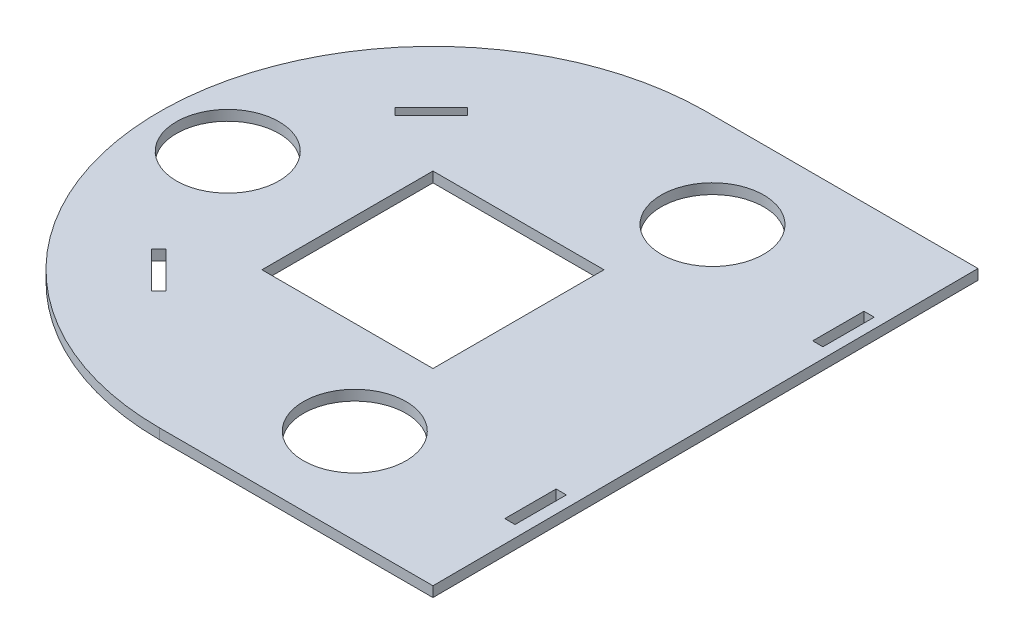
ISO-10303-21;
HEADER;
FILE_DESCRIPTION(('STEP AP214'),'2;1');
FILE_NAME('part.step','',(''),(''),'','','');
FILE_SCHEMA(('AUTOMOTIVE_DESIGN { 1 0 10303 214 1 1 1 1 }'));
ENDSEC;
DATA;
#1=APPLICATION_CONTEXT('core data for automotive mechanical design processes');
#2=APPLICATION_PROTOCOL_DEFINITION('international standard','automotive_design',2000,#1);
#3=PRODUCT_CONTEXT('',#1,'mechanical');
#4=PRODUCT('Part','Part','',(#3));
#5=PRODUCT_RELATED_PRODUCT_CATEGORY('part','',(#4));
#6=PRODUCT_DEFINITION_FORMATION('','',#4);
#7=PRODUCT_DEFINITION_CONTEXT('part definition',#1,'design');
#8=PRODUCT_DEFINITION('design','',#6,#7);
#9=PRODUCT_DEFINITION_SHAPE('','',#8);
#10=(LENGTH_UNIT() NAMED_UNIT(*) SI_UNIT(.MILLI.,.METRE.));
#11=(NAMED_UNIT(*) PLANE_ANGLE_UNIT() SI_UNIT($,.RADIAN.));
#12=(NAMED_UNIT(*) SI_UNIT($,.STERADIAN.) SOLID_ANGLE_UNIT());
#13=UNCERTAINTY_MEASURE_WITH_UNIT(LENGTH_MEASURE(1.E-05),#10,'distance_accuracy_value','');
#14=(GEOMETRIC_REPRESENTATION_CONTEXT(3) GLOBAL_UNCERTAINTY_ASSIGNED_CONTEXT((#13)) GLOBAL_UNIT_ASSIGNED_CONTEXT((#10,
#11,#12)) REPRESENTATION_CONTEXT('',''));
#15=CARTESIAN_POINT('',(0.,0.,0.));
#16=DIRECTION('',(0.,0.,1.));
#17=DIRECTION('',(1.,0.,0.));
#18=AXIS2_PLACEMENT_3D('',#15,#16,#17);
#19=CARTESIAN_POINT('',(0.,3.,54.9972823705687));
#20=DIRECTION('',(0.,0.,-1.));
#21=DIRECTION('',(-1.,0.,0.));
#22=AXIS2_PLACEMENT_3D('',#19,#20,#21);
#23=PLANE('',#22);
#24=DIRECTION('',(1.,0.,0.));
#25=VECTOR('',#24,1.);
#26=CARTESIAN_POINT('',(0.,0.,54.9972823705687));
#27=LINE('',#26,#25);
#28=CARTESIAN_POINT('',(-24.3405962363661,0.,54.9972823705687));
#29=VERTEX_POINT('',#28);
#30=CARTESIAN_POINT('',(25.6594037636339,0.,54.9972823705687));
#31=VERTEX_POINT('',#30);
#32=EDGE_CURVE('E259',#29,#31,#27,.T.);
#33=ORIENTED_EDGE('',*,*,#32,.T.);
#34=DIRECTION('',(0.,-1.,0.));
#35=VECTOR('',#34,1.);
#36=CARTESIAN_POINT('',(25.6594037636339,3.,54.9972823705687));
#37=LINE('',#36,#35);
#38=CARTESIAN_POINT('',(25.6594037636339,3.,54.9972823705687));
#39=VERTEX_POINT('',#38);
#40=EDGE_CURVE('E11',#39,#31,#37,.T.);
#41=ORIENTED_EDGE('',*,*,#40,.F.);
#42=DIRECTION('',(1.,0.,0.));
#43=VECTOR('',#42,1.);
#44=CARTESIAN_POINT('',(0.,3.,54.9972823705687));
#45=LINE('',#44,#43);
#46=CARTESIAN_POINT('',(-24.3405962363661,3.,54.9972823705687));
#47=VERTEX_POINT('',#46);
#48=EDGE_CURVE('E181',#47,#39,#45,.T.);
#49=ORIENTED_EDGE('',*,*,#48,.F.);
#50=DIRECTION('',(0.,-1.,0.));
#51=VECTOR('',#50,1.);
#52=CARTESIAN_POINT('',(-24.3405962363661,3.,54.9972823705687));
#53=LINE('',#52,#51);
#54=EDGE_CURVE('E54',#47,#29,#53,.T.);
#55=ORIENTED_EDGE('',*,*,#54,.T.);
#56=EDGE_LOOP('',(#33,#41,#49,#55));
#57=FACE_BOUND('',#56,.T.);
#58=ADVANCED_FACE('F35',(#57),#23,.F.);
#59=CARTESIAN_POINT('',(25.6594037636339,3.,0.));
#60=DIRECTION('',(1.,0.,0.));
#61=DIRECTION('',(0.,0.,-1.));
#62=AXIS2_PLACEMENT_3D('',#59,#60,#61);
#63=PLANE('',#62);
#64=DIRECTION('',(0.,0.,1.));
#65=VECTOR('',#64,1.);
#66=CARTESIAN_POINT('',(25.6594037636339,0.,0.));
#67=LINE('',#66,#65);
#68=CARTESIAN_POINT('',(25.6594037636339,0.,104.997282370569));
#69=VERTEX_POINT('',#68);
#70=EDGE_CURVE('E187',#31,#69,#67,.T.);
#71=ORIENTED_EDGE('',*,*,#70,.T.);
#72=DIRECTION('',(0.,-1.,0.));
#73=VECTOR('',#72,1.);
#74=CARTESIAN_POINT('',(25.6594037636339,3.,104.997282370569));
#75=LINE('',#74,#73);
#76=CARTESIAN_POINT('',(25.6594037636339,3.,104.997282370569));
#77=VERTEX_POINT('',#76);
#78=EDGE_CURVE('E45',#77,#69,#75,.T.);
#79=ORIENTED_EDGE('',*,*,#78,.F.);
#80=DIRECTION('',(0.,0.,1.));
#81=VECTOR('',#80,1.);
#82=CARTESIAN_POINT('',(25.6594037636339,3.,0.));
#83=LINE('',#82,#81);
#84=EDGE_CURVE('E175',#39,#77,#83,.T.);
#85=ORIENTED_EDGE('',*,*,#84,.F.);
#86=ORIENTED_EDGE('',*,*,#40,.T.);
#87=EDGE_LOOP('',(#71,#79,#85,#86));
#88=FACE_BOUND('',#87,.T.);
#89=ADVANCED_FACE('F186',(#88),#63,.F.);
#90=CARTESIAN_POINT('',(0.,3.,104.997282370569));
#91=DIRECTION('',(0.,0.,-1.));
#92=DIRECTION('',(-1.,0.,0.));
#93=AXIS2_PLACEMENT_3D('',#90,#91,#92);
#94=PLANE('',#93);
#95=DIRECTION('',(1.,0.,0.));
#96=VECTOR('',#95,1.);
#97=CARTESIAN_POINT('',(0.,0.,104.997282370569));
#98=LINE('',#97,#96);
#99=CARTESIAN_POINT('',(-24.3405962363661,0.,104.997282370569));
#100=VERTEX_POINT('',#99);
#101=EDGE_CURVE('E262',#100,#69,#98,.T.);
#102=ORIENTED_EDGE('',*,*,#101,.F.);
#103=DIRECTION('',(0.,-1.,0.));
#104=VECTOR('',#103,1.);
#105=CARTESIAN_POINT('',(-24.3405962363661,3.,104.997282370569));
#106=LINE('',#105,#104);
#107=CARTESIAN_POINT('',(-24.3405962363661,3.,104.997282370569));
#108=VERTEX_POINT('',#107);
#109=EDGE_CURVE('E114',#108,#100,#106,.T.);
#110=ORIENTED_EDGE('',*,*,#109,.F.);
#111=DIRECTION('',(1.,0.,0.));
#112=VECTOR('',#111,1.);
#113=CARTESIAN_POINT('',(0.,3.,104.997282370569));
#114=LINE('',#113,#112);
#115=EDGE_CURVE('E180',#108,#77,#114,.T.);
#116=ORIENTED_EDGE('',*,*,#115,.T.);
#117=ORIENTED_EDGE('',*,*,#78,.T.);
#118=EDGE_LOOP('',(#102,#110,#116,#117));
#119=FACE_BOUND('',#118,.T.);
#120=ADVANCED_FACE('F191',(#119),#94,.T.);
#121=CARTESIAN_POINT('',(77.1594037636339,3.,0.));
#122=DIRECTION('',(-1.,0.,0.));
#123=DIRECTION('',(0.,0.,1.));
#124=AXIS2_PLACEMENT_3D('',#121,#122,#123);
#125=PLANE('',#124);
#126=DIRECTION('',(0.,0.,-1.));
#127=VECTOR('',#126,1.);
#128=CARTESIAN_POINT('',(77.1594037636339,0.,0.));
#129=LINE('',#128,#127);
#130=CARTESIAN_POINT('',(77.1594037636339,0.,42.4972823705687));
#131=VERTEX_POINT('',#130);
#132=CARTESIAN_POINT('',(77.1594037636339,0.,27.4972823705687));
#133=VERTEX_POINT('',#132);
#134=EDGE_CURVE('E244',#131,#133,#129,.T.);
#135=ORIENTED_EDGE('',*,*,#134,.F.);
#136=DIRECTION('',(0.,-1.,0.));
#137=VECTOR('',#136,1.);
#138=CARTESIAN_POINT('',(77.1594037636339,3.,42.4972823705687));
#139=LINE('',#138,#137);
#140=CARTESIAN_POINT('',(77.1594037636339,3.,42.4972823705687));
#141=VERTEX_POINT('',#140);
#142=EDGE_CURVE('E269',#141,#131,#139,.T.);
#143=ORIENTED_EDGE('',*,*,#142,.F.);
#144=DIRECTION('',(0.,0.,-1.));
#145=VECTOR('',#144,1.);
#146=CARTESIAN_POINT('',(77.1594037636339,3.,0.));
#147=LINE('',#146,#145);
#148=CARTESIAN_POINT('',(77.1594037636339,3.,27.4972823705687));
#149=VERTEX_POINT('',#148);
#150=EDGE_CURVE('E390',#141,#149,#147,.T.);
#151=ORIENTED_EDGE('',*,*,#150,.T.);
#152=DIRECTION('',(0.,-1.,0.));
#153=VECTOR('',#152,1.);
#154=CARTESIAN_POINT('',(77.1594037636339,3.,27.4972823705687));
#155=LINE('',#154,#153);
#156=EDGE_CURVE('E271',#149,#133,#155,.T.);
#157=ORIENTED_EDGE('',*,*,#156,.T.);
#158=EDGE_LOOP('',(#135,#143,#151,#157));
#159=FACE_BOUND('',#158,.T.);
#160=ADVANCED_FACE('F446',(#159),#125,.T.);
#161=CARTESIAN_POINT('',(0.,3.,42.4972823705687));
#162=DIRECTION('',(0.,0.,1.));
#163=DIRECTION('',(1.,0.,0.));
#164=AXIS2_PLACEMENT_3D('',#161,#162,#163);
#165=PLANE('',#164);
#166=DIRECTION('',(-1.,0.,0.));
#167=VECTOR('',#166,1.);
#168=CARTESIAN_POINT('',(0.,0.,42.4972823705687));
#169=LINE('',#168,#167);
#170=CARTESIAN_POINT('',(74.1594037636339,0.,42.4972823705687));
#171=VERTEX_POINT('',#170);
#172=EDGE_CURVE('E247',#131,#171,#169,.T.);
#173=ORIENTED_EDGE('',*,*,#172,.T.);
#174=DIRECTION('',(0.,-1.,0.));
#175=VECTOR('',#174,1.);
#176=CARTESIAN_POINT('',(74.1594037636339,3.,42.4972823705687));
#177=LINE('',#176,#175);
#178=CARTESIAN_POINT('',(74.1594037636339,3.,42.4972823705687));
#179=VERTEX_POINT('',#178);
#180=EDGE_CURVE('E276',#179,#171,#177,.T.);
#181=ORIENTED_EDGE('',*,*,#180,.F.);
#182=DIRECTION('',(-1.,0.,0.));
#183=VECTOR('',#182,1.);
#184=CARTESIAN_POINT('',(0.,3.,42.4972823705687));
#185=LINE('',#184,#183);
#186=EDGE_CURVE('E393',#141,#179,#185,.T.);
#187=ORIENTED_EDGE('',*,*,#186,.F.);
#188=ORIENTED_EDGE('',*,*,#142,.T.);
#189=EDGE_LOOP('',(#173,#181,#187,#188));
#190=FACE_BOUND('',#189,.T.);
#191=ADVANCED_FACE('F442',(#190),#165,.F.);
#192=CARTESIAN_POINT('',(74.1594037636339,3.,0.));
#193=DIRECTION('',(-1.,0.,0.));
#194=DIRECTION('',(0.,0.,1.));
#195=AXIS2_PLACEMENT_3D('',#192,#193,#194);
#196=PLANE('',#195);
#197=DIRECTION('',(0.,0.,-1.));
#198=VECTOR('',#197,1.);
#199=CARTESIAN_POINT('',(74.1594037636339,0.,0.));
#200=LINE('',#199,#198);
#201=CARTESIAN_POINT('',(74.1594037636339,0.,27.4972823705687));
#202=VERTEX_POINT('',#201);
#203=EDGE_CURVE('E250',#171,#202,#200,.T.);
#204=ORIENTED_EDGE('',*,*,#203,.T.);
#205=DIRECTION('',(0.,-1.,0.));
#206=VECTOR('',#205,1.);
#207=CARTESIAN_POINT('',(74.1594037636339,3.,27.4972823705687));
#208=LINE('',#207,#206);
#209=CARTESIAN_POINT('',(74.1594037636339,3.,27.4972823705687));
#210=VERTEX_POINT('',#209);
#211=EDGE_CURVE('E273',#210,#202,#208,.T.);
#212=ORIENTED_EDGE('',*,*,#211,.F.);
#213=DIRECTION('',(0.,0.,-1.));
#214=VECTOR('',#213,1.);
#215=CARTESIAN_POINT('',(74.1594037636339,3.,0.));
#216=LINE('',#215,#214);
#217=EDGE_CURVE('E396',#179,#210,#216,.T.);
#218=ORIENTED_EDGE('',*,*,#217,.F.);
#219=ORIENTED_EDGE('',*,*,#180,.T.);
#220=EDGE_LOOP('',(#204,#212,#218,#219));
#221=FACE_BOUND('',#220,.T.);
#222=ADVANCED_FACE('F438',(#221),#196,.F.);
#223=CARTESIAN_POINT('',(77.1594037636339,3.,0.));
#224=DIRECTION('',(1.,0.,0.));
#225=DIRECTION('',(0.,0.,-1.));
#226=AXIS2_PLACEMENT_3D('',#223,#224,#225);
#227=PLANE('',#226);
#228=DIRECTION('',(0.,0.,1.));
#229=VECTOR('',#228,1.);
#230=CARTESIAN_POINT('',(77.1594037636339,0.,0.));
#231=LINE('',#230,#229);
#232=CARTESIAN_POINT('',(77.1594037636339,0.,117.497282370569));
#233=VERTEX_POINT('',#232);
#234=CARTESIAN_POINT('',(77.1594037636339,0.,132.497282370569));
#235=VERTEX_POINT('',#234);
#236=EDGE_CURVE('E232',#233,#235,#231,.T.);
#237=ORIENTED_EDGE('',*,*,#236,.T.);
#238=DIRECTION('',(0.,-1.,0.));
#239=VECTOR('',#238,1.);
#240=CARTESIAN_POINT('',(77.1594037636339,3.,132.497282370569));
#241=LINE('',#240,#239);
#242=CARTESIAN_POINT('',(77.1594037636339,3.,132.497282370569));
#243=VERTEX_POINT('',#242);
#244=EDGE_CURVE('E274',#243,#235,#241,.T.);
#245=ORIENTED_EDGE('',*,*,#244,.F.);
#246=DIRECTION('',(0.,0.,1.));
#247=VECTOR('',#246,1.);
#248=CARTESIAN_POINT('',(77.1594037636339,3.,0.));
#249=LINE('',#248,#247);
#250=CARTESIAN_POINT('',(77.1594037636339,3.,117.497282370569));
#251=VERTEX_POINT('',#250);
#252=EDGE_CURVE('E379',#251,#243,#249,.T.);
#253=ORIENTED_EDGE('',*,*,#252,.F.);
#254=DIRECTION('',(0.,-1.,0.));
#255=VECTOR('',#254,1.);
#256=CARTESIAN_POINT('',(77.1594037636339,3.,117.497282370569));
#257=LINE('',#256,#255);
#258=EDGE_CURVE('E280',#251,#233,#257,.T.);
#259=ORIENTED_EDGE('',*,*,#258,.T.);
#260=EDGE_LOOP('',(#237,#245,#253,#259));
#261=FACE_BOUND('',#260,.T.);
#262=ADVANCED_FACE('F441',(#261),#227,.F.);
#263=CARTESIAN_POINT('',(0.,3.,132.497282370569));
#264=DIRECTION('',(0.,0.,1.));
#265=DIRECTION('',(1.,0.,0.));
#266=AXIS2_PLACEMENT_3D('',#263,#264,#265);
#267=PLANE('',#266);
#268=DIRECTION('',(-1.,0.,0.));
#269=VECTOR('',#268,1.);
#270=CARTESIAN_POINT('',(0.,0.,132.497282370569));
#271=LINE('',#270,#269);
#272=CARTESIAN_POINT('',(74.1594037636339,0.,132.497282370569));
#273=VERTEX_POINT('',#272);
#274=EDGE_CURVE('E235',#235,#273,#271,.T.);
#275=ORIENTED_EDGE('',*,*,#274,.T.);
#276=DIRECTION('',(0.,-1.,0.));
#277=VECTOR('',#276,1.);
#278=CARTESIAN_POINT('',(74.1594037636339,3.,132.497282370569));
#279=LINE('',#278,#277);
#280=CARTESIAN_POINT('',(74.1594037636339,3.,132.497282370569));
#281=VERTEX_POINT('',#280);
#282=EDGE_CURVE('E284',#281,#273,#279,.T.);
#283=ORIENTED_EDGE('',*,*,#282,.F.);
#284=DIRECTION('',(-1.,0.,0.));
#285=VECTOR('',#284,1.);
#286=CARTESIAN_POINT('',(0.,3.,132.497282370569));
#287=LINE('',#286,#285);
#288=EDGE_CURVE('E382',#243,#281,#287,.T.);
#289=ORIENTED_EDGE('',*,*,#288,.F.);
#290=ORIENTED_EDGE('',*,*,#244,.T.);
#291=EDGE_LOOP('',(#275,#283,#289,#290));
#292=FACE_BOUND('',#291,.T.);
#293=ADVANCED_FACE('F458',(#292),#267,.F.);
#294=CARTESIAN_POINT('',(74.1594037636339,3.,0.));
#295=DIRECTION('',(1.,0.,0.));
#296=DIRECTION('',(0.,0.,-1.));
#297=AXIS2_PLACEMENT_3D('',#294,#295,#296);
#298=PLANE('',#297);
#299=DIRECTION('',(0.,0.,1.));
#300=VECTOR('',#299,1.);
#301=CARTESIAN_POINT('',(74.1594037636339,0.,0.));
#302=LINE('',#301,#300);
#303=CARTESIAN_POINT('',(74.1594037636339,0.,117.497282370569));
#304=VERTEX_POINT('',#303);
#305=EDGE_CURVE('E238',#304,#273,#302,.T.);
#306=ORIENTED_EDGE('',*,*,#305,.F.);
#307=DIRECTION('',(0.,-1.,0.));
#308=VECTOR('',#307,1.);
#309=CARTESIAN_POINT('',(74.1594037636339,3.,117.497282370569));
#310=LINE('',#309,#308);
#311=CARTESIAN_POINT('',(74.1594037636339,3.,117.497282370569));
#312=VERTEX_POINT('',#311);
#313=EDGE_CURVE('E282',#312,#304,#310,.T.);
#314=ORIENTED_EDGE('',*,*,#313,.F.);
#315=DIRECTION('',(0.,0.,1.));
#316=VECTOR('',#315,1.);
#317=CARTESIAN_POINT('',(74.1594037636339,3.,0.));
#318=LINE('',#317,#316);
#319=EDGE_CURVE('E384',#312,#281,#318,.T.);
#320=ORIENTED_EDGE('',*,*,#319,.T.);
#321=ORIENTED_EDGE('',*,*,#282,.T.);
#322=EDGE_LOOP('',(#306,#314,#320,#321));
#323=FACE_BOUND('',#322,.T.);
#324=ADVANCED_FACE('F455',(#323),#298,.T.);
#325=CARTESIAN_POINT('',(-34.613425110742,3.,34.613425110744));
#326=DIRECTION('',(-0.707106781186527,0.,0.707106781186568));
#327=DIRECTION('',(0.707106781186568,0.,0.707106781186527));
#328=AXIS2_PLACEMENT_3D('',#325,#326,#327);
#329=PLANE('',#328);
#330=DIRECTION('',(-0.707106781186568,0.,-0.707106781186527));
#331=VECTOR('',#330,1.);
#332=CARTESIAN_POINT('',(-34.613425110742,0.,34.613425110744));
#333=LINE('',#332,#331);
#334=CARTESIAN_POINT('',(-33.3059973823827,0.,35.9208528391031));
#335=VERTEX_POINT('',#334);
#336=CARTESIAN_POINT('',(-35.4273177259424,0.,33.7995324955436));
#337=VERTEX_POINT('',#336);
#338=EDGE_CURVE('E201',#335,#337,#333,.T.);
#339=ORIENTED_EDGE('',*,*,#338,.F.);
#340=DIRECTION('',(0.,-1.,0.));
#341=VECTOR('',#340,1.);
#342=CARTESIAN_POINT('',(-33.3059973823827,3.,35.9208528391031));
#343=LINE('',#342,#341);
#344=CARTESIAN_POINT('',(-33.3059973823827,3.,35.9208528391031));
#345=VERTEX_POINT('',#344);
#346=EDGE_CURVE('E39',#345,#335,#343,.T.);
#347=ORIENTED_EDGE('',*,*,#346,.F.);
#348=DIRECTION('',(-0.707106781186568,0.,-0.707106781186527));
#349=VECTOR('',#348,1.);
#350=CARTESIAN_POINT('',(-34.613425110742,3.,34.613425110744));
#351=LINE('',#350,#349);
#352=CARTESIAN_POINT('',(-35.4273177259424,3.,33.7995324955436));
#353=VERTEX_POINT('',#352);
#354=EDGE_CURVE('E322',#345,#353,#351,.T.);
#355=ORIENTED_EDGE('',*,*,#354,.T.);
#356=DIRECTION('',(0.,-1.,0.));
#357=VECTOR('',#356,1.);
#358=CARTESIAN_POINT('',(-35.4273177259424,3.,33.7995324955436));
#359=LINE('',#358,#357);
#360=EDGE_CURVE('E319',#353,#337,#359,.T.);
#361=ORIENTED_EDGE('',*,*,#360,.T.);
#362=EDGE_LOOP('',(#339,#347,#355,#361));
#363=FACE_BOUND('',#362,.T.);
#364=ADVANCED_FACE('F317',(#363),#329,.T.);
#365=CARTESIAN_POINT('',(1.30742772836017,3.,1.30742772836016));
#366=DIRECTION('',(0.707106781186548,0.,0.707106781186546));
#367=DIRECTION('',(0.707106781186546,0.,-0.707106781186549));
#368=AXIS2_PLACEMENT_3D('',#365,#366,#367);
#369=PLANE('',#368);
#370=DIRECTION('',(-0.707106781186546,0.,0.707106781186549));
#371=VECTOR('',#370,1.);
#372=CARTESIAN_POINT('',(1.30742772836017,0.,1.30742772836016));
#373=LINE('',#372,#371);
#374=CARTESIAN_POINT('',(-43.912599100181,0.,46.5274545569014));
#375=VERTEX_POINT('',#374);
#376=EDGE_CURVE('E205',#335,#375,#373,.T.);
#377=ORIENTED_EDGE('',*,*,#376,.T.);
#378=DIRECTION('',(0.,-1.,0.));
#379=VECTOR('',#378,1.);
#380=CARTESIAN_POINT('',(-43.912599100181,3.,46.5274545569014));
#381=LINE('',#380,#379);
#382=CARTESIAN_POINT('',(-43.912599100181,3.,46.5274545569014));
#383=VERTEX_POINT('',#382);
#384=EDGE_CURVE('E301',#383,#375,#381,.T.);
#385=ORIENTED_EDGE('',*,*,#384,.F.);
#386=DIRECTION('',(-0.707106781186546,0.,0.707106781186549));
#387=VECTOR('',#386,1.);
#388=CARTESIAN_POINT('',(1.30742772836017,3.,1.30742772836016));
#389=LINE('',#388,#387);
#390=EDGE_CURVE('E309',#345,#383,#389,.T.);
#391=ORIENTED_EDGE('',*,*,#390,.F.);
#392=ORIENTED_EDGE('',*,*,#346,.T.);
#393=EDGE_LOOP('',(#377,#385,#391,#392));
#394=FACE_BOUND('',#393,.T.);
#395=ADVANCED_FACE('F307',(#394),#369,.F.);
#396=CARTESIAN_POINT('',(-45.2200268285425,3.,45.2200268285398));
#397=DIRECTION('',(-0.707106781186568,0.,0.707106781186527));
#398=DIRECTION('',(0.707106781186527,0.,0.707106781186568));
#399=AXIS2_PLACEMENT_3D('',#396,#397,#398);
#400=PLANE('',#399);
#401=DIRECTION('',(-0.707106781186527,0.,-0.707106781186568));
#402=VECTOR('',#401,1.);
#403=CARTESIAN_POINT('',(-45.2200268285425,0.,45.2200268285398));
#404=LINE('',#403,#402);
#405=CARTESIAN_POINT('',(-46.0339194437405,0.,44.4061342133417));
#406=VERTEX_POINT('',#405);
#407=EDGE_CURVE('E208',#375,#406,#404,.T.);
#408=ORIENTED_EDGE('',*,*,#407,.T.);
#409=DIRECTION('',(0.,-1.,0.));
#410=VECTOR('',#409,1.);
#411=CARTESIAN_POINT('',(-46.0339194437405,3.,44.4061342133417));
#412=LINE('',#411,#410);
#413=CARTESIAN_POINT('',(-46.0339194437405,3.,44.4061342133417));
#414=VERTEX_POINT('',#413);
#415=EDGE_CURVE('E202',#414,#406,#412,.T.);
#416=ORIENTED_EDGE('',*,*,#415,.F.);
#417=DIRECTION('',(-0.707106781186527,0.,-0.707106781186568));
#418=VECTOR('',#417,1.);
#419=CARTESIAN_POINT('',(-45.2200268285425,3.,45.2200268285398));
#420=LINE('',#419,#418);
#421=EDGE_CURVE('E357',#383,#414,#420,.T.);
#422=ORIENTED_EDGE('',*,*,#421,.F.);
#423=ORIENTED_EDGE('',*,*,#384,.T.);
#424=EDGE_LOOP('',(#408,#416,#422,#423));
#425=FACE_BOUND('',#424,.T.);
#426=ADVANCED_FACE('F491',(#425),#400,.F.);
#427=CARTESIAN_POINT('',(-59.3405962363661,3.,79.9972823705687));
#428=DIRECTION('',(0.,-1.,0.));
#429=DIRECTION('',(0.,0.,-1.));
#430=AXIS2_PLACEMENT_3D('',#427,#428,#429);
#431=CYLINDRICAL_SURFACE('',#430,15.);
#432=CARTESIAN_POINT('',(-59.3405962363661,0.,79.9972823705687));
#433=DIRECTION('',(0.,1.,0.));
#434=DIRECTION('',(0.,0.,1.));
#435=AXIS2_PLACEMENT_3D('',#432,#433,#434);
#436=CIRCLE('',#435,15.);
#437=CARTESIAN_POINT('',(-59.3405962363661,0.,94.9972823705687));
#438=VERTEX_POINT('',#437);
#439=EDGE_CURVE('E211',#438,#438,#436,.T.);
#440=ORIENTED_EDGE('',*,*,#439,.F.);
#441=EDGE_LOOP('',(#440));
#442=FACE_BOUND('',#441,.T.);
#443=CARTESIAN_POINT('',(-59.3405962363661,3.,79.9972823705687));
#444=DIRECTION('',(0.,1.,0.));
#445=DIRECTION('',(0.,0.,1.));
#446=AXIS2_PLACEMENT_3D('',#443,#444,#445);
#447=CIRCLE('',#446,15.);
#448=CARTESIAN_POINT('',(-59.3405962363661,3.,94.9972823705687));
#449=VERTEX_POINT('',#448);
#450=EDGE_CURVE('E360',#449,#449,#447,.T.);
#451=ORIENTED_EDGE('',*,*,#450,.T.);
#452=EDGE_LOOP('',(#451));
#453=FACE_BOUND('',#452,.T.);
#454=ADVANCED_FACE('F487',(#442,#453),#431,.F.);
#455=CARTESIAN_POINT('',(35.1076382312319,3.,35.1076382312318));
#456=DIRECTION('',(-0.707106781186548,0.,-0.707106781186546));
#457=DIRECTION('',(-0.707106781186546,0.,0.707106781186549));
#458=AXIS2_PLACEMENT_3D('',#455,#456,#457);
#459=PLANE('',#458);
#460=DIRECTION('',(0.707106781186546,0.,-0.707106781186549));
#461=VECTOR('',#460,1.);
#462=CARTESIAN_POINT('',(35.1076382312319,0.,35.1076382312318));
#463=LINE('',#462,#461);
#464=CARTESIAN_POINT('',(-45.7042175619236,0.,115.919494024388));
#465=VERTEX_POINT('',#464);
#466=CARTESIAN_POINT('',(-43.5828972183639,0.,113.798173680828));
#467=VERTEX_POINT('',#466);
#468=EDGE_CURVE('E214',#465,#467,#463,.T.);
#469=ORIENTED_EDGE('',*,*,#468,.T.);
#470=DIRECTION('',(0.,-1.,0.));
#471=VECTOR('',#470,1.);
#472=CARTESIAN_POINT('',(-43.5828972183639,3.,113.798173680828));
#473=LINE('',#472,#471);
#474=CARTESIAN_POINT('',(-43.5828972183639,3.,113.798173680828));
#475=VERTEX_POINT('',#474);
#476=EDGE_CURVE('E300',#475,#467,#473,.T.);
#477=ORIENTED_EDGE('',*,*,#476,.F.);
#478=DIRECTION('',(0.707106781186546,0.,-0.707106781186549));
#479=VECTOR('',#478,1.);
#480=CARTESIAN_POINT('',(35.1076382312319,3.,35.1076382312318));
#481=LINE('',#480,#479);
#482=CARTESIAN_POINT('',(-45.7042175619236,3.,115.919494024388));
#483=VERTEX_POINT('',#482);
#484=EDGE_CURVE('E363',#483,#475,#481,.T.);
#485=ORIENTED_EDGE('',*,*,#484,.F.);
#486=DIRECTION('',(0.,-1.,0.));
#487=VECTOR('',#486,1.);
#488=CARTESIAN_POINT('',(-45.7042175619236,3.,115.919494024388));
#489=LINE('',#488,#487);
#490=EDGE_CURVE('E347',#483,#465,#489,.T.);
#491=ORIENTED_EDGE('',*,*,#490,.T.);
#492=EDGE_LOOP('',(#469,#477,#485,#491));
#493=FACE_BOUND('',#492,.T.);
#494=ADVANCED_FACE('F483',(#493),#459,.F.);
#495=CARTESIAN_POINT('',(-78.690535449596,3.,78.6905354495957));
#496=DIRECTION('',(-0.707106781186549,0.,0.707106781186546));
#497=DIRECTION('',(0.707106781186546,0.,0.707106781186549));
#498=AXIS2_PLACEMENT_3D('',#495,#496,#497);
#499=PLANE('',#498);
#500=DIRECTION('',(-0.707106781186546,0.,-0.707106781186549));
#501=VECTOR('',#500,1.);
#502=CARTESIAN_POINT('',(-78.690535449596,0.,78.6905354495957));
#503=LINE('',#502,#501);
#504=CARTESIAN_POINT('',(-32.9762955005658,0.,124.404775398626));
#505=VERTEX_POINT('',#504);
#506=EDGE_CURVE('E217',#505,#467,#503,.T.);
#507=ORIENTED_EDGE('',*,*,#506,.F.);
#508=DIRECTION('',(0.,-1.,0.));
#509=VECTOR('',#508,1.);
#510=CARTESIAN_POINT('',(-32.9762955005658,3.,124.404775398626));
#511=LINE('',#510,#509);
#512=CARTESIAN_POINT('',(-32.9762955005658,3.,124.404775398626));
#513=VERTEX_POINT('',#512);
#514=EDGE_CURVE('E298',#513,#505,#511,.T.);
#515=ORIENTED_EDGE('',*,*,#514,.F.);
#516=DIRECTION('',(-0.707106781186546,0.,-0.707106781186549));
#517=VECTOR('',#516,1.);
#518=CARTESIAN_POINT('',(-78.690535449596,3.,78.6905354495957));
#519=LINE('',#518,#517);
#520=EDGE_CURVE('E365',#513,#475,#519,.T.);
#521=ORIENTED_EDGE('',*,*,#520,.T.);
#522=ORIENTED_EDGE('',*,*,#476,.T.);
#523=EDGE_LOOP('',(#507,#515,#521,#522));
#524=FACE_BOUND('',#523,.T.);
#525=ADVANCED_FACE('F479',(#524),#499,.T.);
#526=CARTESIAN_POINT('',(45.7142399490302,3.,45.7142399490302));
#527=DIRECTION('',(-0.707106781186547,0.,-0.707106781186547));
#528=DIRECTION('',(-0.707106781186548,0.,0.707106781186548));
#529=AXIS2_PLACEMENT_3D('',#526,#527,#528);
#530=PLANE('',#529);
#531=DIRECTION('',(0.707106781186548,0.,-0.707106781186548));
#532=VECTOR('',#531,1.);
#533=CARTESIAN_POINT('',(45.7142399490302,0.,45.7142399490302));
#534=LINE('',#533,#532);
#535=CARTESIAN_POINT('',(-35.0976158441254,0.,126.526095742186));
#536=VERTEX_POINT('',#535);
#537=EDGE_CURVE('E220',#536,#505,#534,.T.);
#538=ORIENTED_EDGE('',*,*,#537,.F.);
#539=DIRECTION('',(0.,-1.,0.));
#540=VECTOR('',#539,1.);
#541=CARTESIAN_POINT('',(-35.0976158441254,3.,126.526095742186));
#542=LINE('',#541,#540);
#543=CARTESIAN_POINT('',(-35.0976158441254,3.,126.526095742186));
#544=VERTEX_POINT('',#543);
#545=EDGE_CURVE('E329',#544,#536,#542,.T.);
#546=ORIENTED_EDGE('',*,*,#545,.F.);
#547=DIRECTION('',(0.707106781186548,0.,-0.707106781186548));
#548=VECTOR('',#547,1.);
#549=CARTESIAN_POINT('',(45.7142399490302,3.,45.7142399490302));
#550=LINE('',#549,#548);
#551=EDGE_CURVE('E368',#544,#513,#550,.T.);
#552=ORIENTED_EDGE('',*,*,#551,.T.);
#553=ORIENTED_EDGE('',*,*,#514,.T.);
#554=EDGE_LOOP('',(#538,#546,#552,#553));
#555=FACE_BOUND('',#554,.T.);
#556=ADVANCED_FACE('F475',(#555),#530,.T.);
#557=CARTESIAN_POINT('',(0.,3.,159.997282370569));
#558=DIRECTION('',(0.,0.,-1.));
#559=DIRECTION('',(-1.,0.,0.));
#560=AXIS2_PLACEMENT_3D('',#557,#558,#559);
#561=PLANE('',#560);
#562=DIRECTION('',(1.,0.,0.));
#563=VECTOR('',#562,1.);
#564=CARTESIAN_POINT('',(0.,0.,159.997282370569));
#565=LINE('',#564,#563);
#566=CARTESIAN_POINT('',(0.659403763633895,0.,159.997282370569));
#567=VERTEX_POINT('',#566);
#568=CARTESIAN_POINT('',(80.6594037636339,0.,159.997282370569));
#569=VERTEX_POINT('',#568);
#570=EDGE_CURVE('E223',#567,#569,#565,.T.);
#571=ORIENTED_EDGE('',*,*,#570,.T.);
#572=DIRECTION('',(0.,-1.,0.));
#573=VECTOR('',#572,1.);
#574=CARTESIAN_POINT('',(80.6594037636339,3.,159.997282370569));
#575=LINE('',#574,#573);
#576=CARTESIAN_POINT('',(80.6594037636339,3.,159.997282370569));
#577=VERTEX_POINT('',#576);
#578=EDGE_CURVE('E292',#577,#569,#575,.T.);
#579=ORIENTED_EDGE('',*,*,#578,.F.);
#580=DIRECTION('',(1.,0.,0.));
#581=VECTOR('',#580,1.);
#582=CARTESIAN_POINT('',(0.,3.,159.997282370569));
#583=LINE('',#582,#581);
#584=CARTESIAN_POINT('',(0.659403763633895,3.,159.997282370569));
#585=VERTEX_POINT('',#584);
#586=EDGE_CURVE('E371',#585,#577,#583,.T.);
#587=ORIENTED_EDGE('',*,*,#586,.F.);
#588=DIRECTION('',(0.,-1.,0.));
#589=VECTOR('',#588,1.);
#590=CARTESIAN_POINT('',(0.659403763633895,3.,159.997282370569));
#591=LINE('',#590,#589);
#592=EDGE_CURVE('E295',#585,#567,#591,.T.);
#593=ORIENTED_EDGE('',*,*,#592,.T.);
#594=EDGE_LOOP('',(#571,#579,#587,#593));
#595=FACE_BOUND('',#594,.T.);
#596=ADVANCED_FACE('F471',(#595),#561,.F.);
#597=CARTESIAN_POINT('',(79.9986411852844,3.,-0.329701881816947));
#598=DIRECTION('',(-0.999991507371965,0.,0.00412130852345215));
#599=DIRECTION('',(0.00412130852345215,0.,0.999991507371965));
#600=AXIS2_PLACEMENT_3D('',#597,#598,#599);
#601=PLANE('',#600);
#602=DIRECTION('',(-0.00412130852345215,0.,-0.999991507371965));
#603=VECTOR('',#602,1.);
#604=CARTESIAN_POINT('',(79.9986411852844,0.,-0.329701881816947));
#605=LINE('',#604,#603);
#606=CARTESIAN_POINT('',(80.,0.,0.));
#607=VERTEX_POINT('',#606);
#608=EDGE_CURVE('E226',#569,#607,#605,.T.);
#609=ORIENTED_EDGE('',*,*,#608,.T.);
#610=DIRECTION('',(0.,-1.,0.));
#611=VECTOR('',#610,1.);
#612=CARTESIAN_POINT('',(80.,3.,0.));
#613=LINE('',#612,#611);
#614=CARTESIAN_POINT('',(80.,3.,0.));
#615=VERTEX_POINT('',#614);
#616=EDGE_CURVE('E290',#615,#607,#613,.T.);
#617=ORIENTED_EDGE('',*,*,#616,.F.);
#618=DIRECTION('',(-0.00412130852345215,0.,-0.999991507371965));
#619=VECTOR('',#618,1.);
#620=CARTESIAN_POINT('',(79.9986411852844,3.,-0.329701881816947));
#621=LINE('',#620,#619);
#622=EDGE_CURVE('E374',#577,#615,#621,.T.);
#623=ORIENTED_EDGE('',*,*,#622,.F.);
#624=ORIENTED_EDGE('',*,*,#578,.T.);
#625=EDGE_LOOP('',(#609,#617,#623,#624));
#626=FACE_BOUND('',#625,.T.);
#627=ADVANCED_FACE('F433',(#626),#601,.F.);
#628=CARTESIAN_POINT('',(30.0866407047165,3.,27.7092557677854));
#629=DIRECTION('',(0.,-1.,0.));
#630=DIRECTION('',(0.,0.,-1.));
#631=AXIS2_PLACEMENT_3D('',#628,#629,#630);
#632=CYLINDRICAL_SURFACE('',#631,15.);
#633=CARTESIAN_POINT('',(30.0866407047165,3.,27.7092557677854));
#634=DIRECTION('',(0.,1.,0.));
#635=DIRECTION('',(0.,0.,1.));
#636=AXIS2_PLACEMENT_3D('',#633,#634,#635);
#637=CIRCLE('',#636,15.);
#638=CARTESIAN_POINT('',(30.0866407047165,3.,42.7092557677853));
#639=VERTEX_POINT('',#638);
#640=EDGE_CURVE('E401',#639,#639,#637,.T.);
#641=ORIENTED_EDGE('',*,*,#640,.T.);
#642=EDGE_LOOP('',(#641));
#643=FACE_BOUND('',#642,.T.);
#644=CARTESIAN_POINT('',(30.0866407047165,0.,27.7092557677854));
#645=DIRECTION('',(0.,1.,0.));
#646=DIRECTION('',(0.,0.,1.));
#647=AXIS2_PLACEMENT_3D('',#644,#645,#646);
#648=CIRCLE('',#647,15.);
#649=CARTESIAN_POINT('',(30.0866407047165,0.,42.7092557677853));
#650=VERTEX_POINT('',#649);
#651=EDGE_CURVE('E256',#650,#650,#648,.T.);
#652=ORIENTED_EDGE('',*,*,#651,.F.);
#653=EDGE_LOOP('',(#652));
#654=FACE_BOUND('',#653,.T.);
#655=ADVANCED_FACE('F405',(#643,#654),#632,.F.);
#656=CARTESIAN_POINT('',(0.,3.,27.4972823705687));
#657=DIRECTION('',(0.,0.,1.));
#658=DIRECTION('',(1.,0.,0.));
#659=AXIS2_PLACEMENT_3D('',#656,#657,#658);
#660=PLANE('',#659);
#661=DIRECTION('',(-1.,0.,0.));
#662=VECTOR('',#661,1.);
#663=CARTESIAN_POINT('',(0.,0.,27.4972823705687));
#664=LINE('',#663,#662);
#665=EDGE_CURVE('E253',#133,#202,#664,.T.);
#666=ORIENTED_EDGE('',*,*,#665,.F.);
#667=ORIENTED_EDGE('',*,*,#156,.F.);
#668=DIRECTION('',(-1.,0.,0.));
#669=VECTOR('',#668,1.);
#670=CARTESIAN_POINT('',(0.,3.,27.4972823705687));
#671=LINE('',#670,#669);
#672=EDGE_CURVE('E398',#149,#210,#671,.T.);
#673=ORIENTED_EDGE('',*,*,#672,.T.);
#674=ORIENTED_EDGE('',*,*,#211,.T.);
#675=EDGE_LOOP('',(#666,#667,#673,#674));
#676=FACE_BOUND('',#675,.T.);
#677=ADVANCED_FACE('F432',(#676),#660,.T.);
#678=CARTESIAN_POINT('',(0.,3.,117.497282370569));
#679=DIRECTION('',(0.,0.,1.));
#680=DIRECTION('',(1.,0.,0.));
#681=AXIS2_PLACEMENT_3D('',#678,#679,#680);
#682=PLANE('',#681);
#683=DIRECTION('',(-1.,0.,0.));
#684=VECTOR('',#683,1.);
#685=CARTESIAN_POINT('',(0.,0.,117.497282370569));
#686=LINE('',#685,#684);
#687=EDGE_CURVE('E241',#233,#304,#686,.T.);
#688=ORIENTED_EDGE('',*,*,#687,.F.);
#689=ORIENTED_EDGE('',*,*,#258,.F.);
#690=DIRECTION('',(-1.,0.,0.));
#691=VECTOR('',#690,1.);
#692=CARTESIAN_POINT('',(0.,3.,117.497282370569));
#693=LINE('',#692,#691);
#694=EDGE_CURVE('E387',#251,#312,#693,.T.);
#695=ORIENTED_EDGE('',*,*,#694,.T.);
#696=ORIENTED_EDGE('',*,*,#313,.T.);
#697=EDGE_LOOP('',(#688,#689,#695,#696));
#698=FACE_BOUND('',#697,.T.);
#699=ADVANCED_FACE('F436',(#698),#682,.T.);
#700=CARTESIAN_POINT('',(0.,3.,0.));
#701=DIRECTION('',(0.,0.,-1.));
#702=DIRECTION('',(-1.,0.,0.));
#703=AXIS2_PLACEMENT_3D('',#700,#701,#702);
#704=PLANE('',#703);
#705=DIRECTION('',(1.,0.,0.));
#706=VECTOR('',#705,1.);
#707=CARTESIAN_POINT('',(0.,0.,0.));
#708=LINE('',#707,#706);
#709=CARTESIAN_POINT('',(0.,0.,0.));
#710=VERTEX_POINT('',#709);
#711=EDGE_CURVE('E229',#710,#607,#708,.T.);
#712=ORIENTED_EDGE('',*,*,#711,.F.);
#713=DIRECTION('',(0.,-1.,0.));
#714=VECTOR('',#713,1.);
#715=CARTESIAN_POINT('',(0.,3.,0.));
#716=LINE('',#715,#714);
#717=CARTESIAN_POINT('',(0.,3.,0.));
#718=VERTEX_POINT('',#717);
#719=EDGE_CURVE('E194',#718,#710,#716,.T.);
#720=ORIENTED_EDGE('',*,*,#719,.F.);
#721=DIRECTION('',(1.,0.,0.));
#722=VECTOR('',#721,1.);
#723=CARTESIAN_POINT('',(0.,3.,0.));
#724=LINE('',#723,#722);
#725=EDGE_CURVE('E376',#718,#615,#724,.T.);
#726=ORIENTED_EDGE('',*,*,#725,.T.);
#727=ORIENTED_EDGE('',*,*,#616,.T.);
#728=EDGE_LOOP('',(#712,#720,#726,#727));
#729=FACE_BOUND('',#728,.T.);
#730=ADVANCED_FACE('F453',(#729),#704,.T.);
#731=CARTESIAN_POINT('',(30.0841733350441,3.,132.286697510436));
#732=DIRECTION('',(0.,-1.,0.));
#733=DIRECTION('',(0.,0.,-1.));
#734=AXIS2_PLACEMENT_3D('',#731,#732,#733);
#735=CYLINDRICAL_SURFACE('',#734,15.);
#736=CARTESIAN_POINT('',(30.0841733350441,3.,132.286697510436));
#737=DIRECTION('',(0.,1.,0.));
#738=DIRECTION('',(0.,0.,1.));
#739=AXIS2_PLACEMENT_3D('',#736,#737,#738);
#740=CIRCLE('',#739,15.);
#741=CARTESIAN_POINT('',(30.0841733350441,3.,147.286697510436));
#742=VERTEX_POINT('',#741);
#743=EDGE_CURVE('E267',#742,#742,#740,.T.);
#744=ORIENTED_EDGE('',*,*,#743,.T.);
#745=EDGE_LOOP('',(#744));
#746=FACE_BOUND('',#745,.T.);
#747=CARTESIAN_POINT('',(30.0841733350441,0.,132.286697510436));
#748=DIRECTION('',(0.,1.,0.));
#749=DIRECTION('',(0.,0.,1.));
#750=AXIS2_PLACEMENT_3D('',#747,#748,#749);
#751=CIRCLE('',#750,15.);
#752=CARTESIAN_POINT('',(30.0841733350441,0.,147.286697510436));
#753=VERTEX_POINT('',#752);
#754=EDGE_CURVE('E198',#753,#753,#751,.T.);
#755=ORIENTED_EDGE('',*,*,#754,.F.);
#756=EDGE_LOOP('',(#755));
#757=FACE_BOUND('',#756,.T.);
#758=ADVANCED_FACE('F37',(#746,#757),#735,.F.);
#759=CARTESIAN_POINT('',(-24.3405962363661,3.,0.));
#760=DIRECTION('',(1.,0.,0.));
#761=DIRECTION('',(0.,0.,-1.));
#762=AXIS2_PLACEMENT_3D('',#759,#760,#761);
#763=PLANE('',#762);
#764=DIRECTION('',(0.,0.,1.));
#765=VECTOR('',#764,1.);
#766=CARTESIAN_POINT('',(-24.3405962363661,0.,0.));
#767=LINE('',#766,#765);
#768=EDGE_CURVE('E264',#29,#100,#767,.T.);
#769=ORIENTED_EDGE('',*,*,#768,.F.);
#770=ORIENTED_EDGE('',*,*,#54,.F.);
#771=DIRECTION('',(0.,0.,1.));
#772=VECTOR('',#771,1.);
#773=CARTESIAN_POINT('',(-24.3405962363661,3.,0.));
#774=LINE('',#773,#772);
#775=EDGE_CURVE('E192',#47,#108,#774,.T.);
#776=ORIENTED_EDGE('',*,*,#775,.T.);
#777=ORIENTED_EDGE('',*,*,#109,.T.);
#778=EDGE_LOOP('',(#769,#770,#776,#777));
#779=FACE_BOUND('',#778,.T.);
#780=ADVANCED_FACE('F409',(#779),#763,.T.);
#781=CARTESIAN_POINT('',(0.,3.,0.));
#782=DIRECTION('',(0.,1.,0.));
#783=DIRECTION('',(0.,0.,1.));
#784=AXIS2_PLACEMENT_3D('',#781,#782,#783);
#785=PLANE('',#784);
#786=ORIENTED_EDGE('',*,*,#450,.F.);
#787=EDGE_LOOP('',(#786));
#788=FACE_BOUND('',#787,.T.);
#789=ORIENTED_EDGE('',*,*,#421,.T.);
#790=DIRECTION('',(-0.707106781186546,0.,0.707106781186549));
#791=VECTOR('',#790,1.);
#792=CARTESIAN_POINT('',(-0.813892615199479,3.,-0.813892615199477));
#793=LINE('',#792,#791);
#794=EDGE_CURVE('E346',#353,#414,#793,.T.);
#795=ORIENTED_EDGE('',*,*,#794,.F.);
#796=ORIENTED_EDGE('',*,*,#354,.F.);
#797=ORIENTED_EDGE('',*,*,#390,.T.);
#798=EDGE_LOOP('',(#789,#795,#796,#797));
#799=FACE_BOUND('',#798,.T.);
#800=ORIENTED_EDGE('',*,*,#725,.F.);
#801=CARTESIAN_POINT('',(0.659403763633895,3.,79.9972823705687));
#802=DIRECTION('',(0.,1.,0.));
#803=DIRECTION('',(0.,0.,1.));
#804=AXIS2_PLACEMENT_3D('',#801,#802,#803);
#805=CIRCLE('',#804,80.);
#806=EDGE_CURVE('E748',#718,#585,#805,.T.);
#807=ORIENTED_EDGE('',*,*,#806,.T.);
#808=ORIENTED_EDGE('',*,*,#586,.T.);
#809=ORIENTED_EDGE('',*,*,#622,.T.);
#810=EDGE_LOOP('',(#800,#807,#808,#809));
#811=FACE_BOUND('',#810,.T.);
#812=ORIENTED_EDGE('',*,*,#551,.F.);
#813=DIRECTION('',(-0.707106781186546,0.,-0.707106781186549));
#814=VECTOR('',#813,1.);
#815=CARTESIAN_POINT('',(-80.8118557931557,3.,80.8118557931553));
#816=LINE('',#815,#814);
#817=EDGE_CURVE('E341',#544,#483,#816,.T.);
#818=ORIENTED_EDGE('',*,*,#817,.T.);
#819=ORIENTED_EDGE('',*,*,#484,.T.);
#820=ORIENTED_EDGE('',*,*,#520,.F.);
#821=EDGE_LOOP('',(#812,#818,#819,#820));
#822=FACE_BOUND('',#821,.T.);
#823=ORIENTED_EDGE('',*,*,#743,.F.);
#824=EDGE_LOOP('',(#823));
#825=FACE_BOUND('',#824,.T.);
#826=ORIENTED_EDGE('',*,*,#252,.T.);
#827=ORIENTED_EDGE('',*,*,#288,.T.);
#828=ORIENTED_EDGE('',*,*,#319,.F.);
#829=ORIENTED_EDGE('',*,*,#694,.F.);
#830=EDGE_LOOP('',(#826,#827,#828,#829));
#831=FACE_BOUND('',#830,.T.);
#832=ORIENTED_EDGE('',*,*,#150,.F.);
#833=ORIENTED_EDGE('',*,*,#186,.T.);
#834=ORIENTED_EDGE('',*,*,#217,.T.);
#835=ORIENTED_EDGE('',*,*,#672,.F.);
#836=EDGE_LOOP('',(#832,#833,#834,#835));
#837=FACE_BOUND('',#836,.T.);
#838=ORIENTED_EDGE('',*,*,#640,.F.);
#839=EDGE_LOOP('',(#838));
#840=FACE_BOUND('',#839,.T.);
#841=ORIENTED_EDGE('',*,*,#48,.T.);
#842=ORIENTED_EDGE('',*,*,#84,.T.);
#843=ORIENTED_EDGE('',*,*,#115,.F.);
#844=ORIENTED_EDGE('',*,*,#775,.F.);
#845=EDGE_LOOP('',(#841,#842,#843,#844));
#846=FACE_BOUND('',#845,.T.);
#847=ADVANCED_FACE('F177',(#788,#799,#811,#822,#825,#831,#837,#840,#846),#785,.T.);
#848=CARTESIAN_POINT('',(0.,0.,0.));
#849=DIRECTION('',(0.,1.,0.));
#850=DIRECTION('',(0.,0.,1.));
#851=AXIS2_PLACEMENT_3D('',#848,#849,#850);
#852=PLANE('',#851);
#853=ORIENTED_EDGE('',*,*,#439,.T.);
#854=EDGE_LOOP('',(#853));
#855=FACE_BOUND('',#854,.T.);
#856=DIRECTION('',(-0.707106781186546,0.,0.707106781186549));
#857=VECTOR('',#856,1.);
#858=CARTESIAN_POINT('',(-0.813892615199479,0.,-0.813892615199477));
#859=LINE('',#858,#857);
#860=EDGE_CURVE('E332',#337,#406,#859,.T.);
#861=ORIENTED_EDGE('',*,*,#860,.T.);
#862=ORIENTED_EDGE('',*,*,#407,.F.);
#863=ORIENTED_EDGE('',*,*,#376,.F.);
#864=ORIENTED_EDGE('',*,*,#338,.T.);
#865=EDGE_LOOP('',(#861,#862,#863,#864));
#866=FACE_BOUND('',#865,.T.);
#867=CARTESIAN_POINT('',(0.659403763633895,0.,79.9972823705687));
#868=DIRECTION('',(0.,1.,0.));
#869=DIRECTION('',(0.,0.,1.));
#870=AXIS2_PLACEMENT_3D('',#867,#868,#869);
#871=CIRCLE('',#870,80.);
#872=EDGE_CURVE('E335',#710,#567,#871,.T.);
#873=ORIENTED_EDGE('',*,*,#872,.F.);
#874=ORIENTED_EDGE('',*,*,#711,.T.);
#875=ORIENTED_EDGE('',*,*,#608,.F.);
#876=ORIENTED_EDGE('',*,*,#570,.F.);
#877=EDGE_LOOP('',(#873,#874,#875,#876));
#878=FACE_BOUND('',#877,.T.);
#879=DIRECTION('',(-0.707106781186546,0.,-0.707106781186549));
#880=VECTOR('',#879,1.);
#881=CARTESIAN_POINT('',(-80.8118557931557,0.,80.8118557931553));
#882=LINE('',#881,#880);
#883=EDGE_CURVE('E338',#536,#465,#882,.T.);
#884=ORIENTED_EDGE('',*,*,#883,.F.);
#885=ORIENTED_EDGE('',*,*,#537,.T.);
#886=ORIENTED_EDGE('',*,*,#506,.T.);
#887=ORIENTED_EDGE('',*,*,#468,.F.);
#888=EDGE_LOOP('',(#884,#885,#886,#887));
#889=FACE_BOUND('',#888,.T.);
#890=ORIENTED_EDGE('',*,*,#754,.T.);
#891=EDGE_LOOP('',(#890));
#892=FACE_BOUND('',#891,.T.);
#893=ORIENTED_EDGE('',*,*,#236,.F.);
#894=ORIENTED_EDGE('',*,*,#687,.T.);
#895=ORIENTED_EDGE('',*,*,#305,.T.);
#896=ORIENTED_EDGE('',*,*,#274,.F.);
#897=EDGE_LOOP('',(#893,#894,#895,#896));
#898=FACE_BOUND('',#897,.T.);
#899=ORIENTED_EDGE('',*,*,#134,.T.);
#900=ORIENTED_EDGE('',*,*,#665,.T.);
#901=ORIENTED_EDGE('',*,*,#203,.F.);
#902=ORIENTED_EDGE('',*,*,#172,.F.);
#903=EDGE_LOOP('',(#899,#900,#901,#902));
#904=FACE_BOUND('',#903,.T.);
#905=ORIENTED_EDGE('',*,*,#651,.T.);
#906=EDGE_LOOP('',(#905));
#907=FACE_BOUND('',#906,.T.);
#908=ORIENTED_EDGE('',*,*,#32,.F.);
#909=ORIENTED_EDGE('',*,*,#768,.T.);
#910=ORIENTED_EDGE('',*,*,#101,.T.);
#911=ORIENTED_EDGE('',*,*,#70,.F.);
#912=EDGE_LOOP('',(#908,#909,#910,#911));
#913=FACE_BOUND('',#912,.T.);
#914=ADVANCED_FACE('F313',(#855,#866,#878,#889,#892,#898,#904,#907,#913),#852,.F.);
#915=CARTESIAN_POINT('',(-0.813892615199479,3.,-0.813892615199477));
#916=DIRECTION('',(0.707106781186548,0.,0.707106781186546));
#917=DIRECTION('',(0.707106781186546,0.,-0.707106781186549));
#918=AXIS2_PLACEMENT_3D('',#915,#916,#917);
#919=PLANE('',#918);
#920=ORIENTED_EDGE('',*,*,#860,.F.);
#921=ORIENTED_EDGE('',*,*,#360,.F.);
#922=ORIENTED_EDGE('',*,*,#794,.T.);
#923=ORIENTED_EDGE('',*,*,#415,.T.);
#924=EDGE_LOOP('',(#920,#921,#922,#923));
#925=FACE_BOUND('',#924,.T.);
#926=ADVANCED_FACE('F333',(#925),#919,.T.);
#927=CARTESIAN_POINT('',(0.659403763633895,3.,79.9972823705687));
#928=DIRECTION('',(0.,-1.,0.));
#929=DIRECTION('',(0.,0.,-1.));
#930=AXIS2_PLACEMENT_3D('',#927,#928,#929);
#931=CYLINDRICAL_SURFACE('',#930,80.);
#932=ORIENTED_EDGE('',*,*,#872,.T.);
#933=ORIENTED_EDGE('',*,*,#592,.F.);
#934=ORIENTED_EDGE('',*,*,#806,.F.);
#935=ORIENTED_EDGE('',*,*,#719,.T.);
#936=EDGE_LOOP('',(#932,#933,#934,#935));
#937=FACE_BOUND('',#936,.T.);
#938=ADVANCED_FACE('F709',(#937),#931,.T.);
#939=CARTESIAN_POINT('',(-80.8118557931557,3.,80.8118557931553));
#940=DIRECTION('',(-0.707106781186549,0.,0.707106781186546));
#941=DIRECTION('',(0.707106781186546,0.,0.707106781186549));
#942=AXIS2_PLACEMENT_3D('',#939,#940,#941);
#943=PLANE('',#942);
#944=ORIENTED_EDGE('',*,*,#883,.T.);
#945=ORIENTED_EDGE('',*,*,#490,.F.);
#946=ORIENTED_EDGE('',*,*,#817,.F.);
#947=ORIENTED_EDGE('',*,*,#545,.T.);
#948=EDGE_LOOP('',(#944,#945,#946,#947));
#949=FACE_BOUND('',#948,.T.);
#950=ADVANCED_FACE('F717',(#949),#943,.F.);
#951=CLOSED_SHELL('',(#58,#89,#120,#160,#191,#222,#262,#293,#324,#364,#395,#426,#454,#494,#525,
#556,#596,#627,#655,#677,#699,#730,#758,#780,#847,#914,#926,#938,#950));
#952=MANIFOLD_SOLID_BREP('B2',#951);
#953=ADVANCED_BREP_SHAPE_REPRESENTATION('',(#18,#952),#14);
#954=SHAPE_DEFINITION_REPRESENTATION(#9,#953);
ENDSEC;
END-ISO-10303-21;
